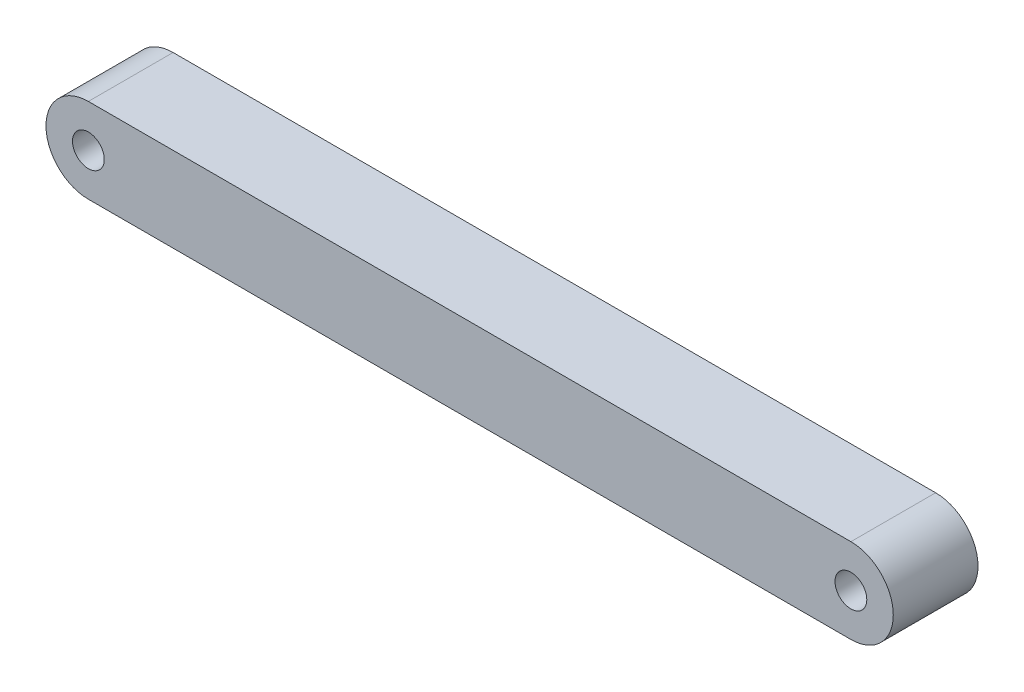
ISO-10303-21;
HEADER;
FILE_DESCRIPTION(('STEP AP214'),'2;1');
FILE_NAME('part.step','',(''),(''),'','','');
FILE_SCHEMA(('AUTOMOTIVE_DESIGN { 1 0 10303 214 1 1 1 1 }'));
ENDSEC;
DATA;
#1=APPLICATION_CONTEXT('core data for automotive mechanical design processes');
#2=APPLICATION_PROTOCOL_DEFINITION('international standard','automotive_design',2000,#1);
#3=PRODUCT_CONTEXT('',#1,'mechanical');
#4=PRODUCT('Part','Part','',(#3));
#5=PRODUCT_RELATED_PRODUCT_CATEGORY('part','',(#4));
#6=PRODUCT_DEFINITION_FORMATION('','',#4);
#7=PRODUCT_DEFINITION_CONTEXT('part definition',#1,'design');
#8=PRODUCT_DEFINITION('design','',#6,#7);
#9=PRODUCT_DEFINITION_SHAPE('','',#8);
#10=(LENGTH_UNIT() NAMED_UNIT(*) SI_UNIT(.MILLI.,.METRE.));
#11=(NAMED_UNIT(*) PLANE_ANGLE_UNIT() SI_UNIT($,.RADIAN.));
#12=(NAMED_UNIT(*) SI_UNIT($,.STERADIAN.) SOLID_ANGLE_UNIT());
#13=UNCERTAINTY_MEASURE_WITH_UNIT(LENGTH_MEASURE(1.E-05),#10,'distance_accuracy_value','');
#14=(GEOMETRIC_REPRESENTATION_CONTEXT(3) GLOBAL_UNCERTAINTY_ASSIGNED_CONTEXT((#13)) GLOBAL_UNIT_ASSIGNED_CONTEXT((#10,
#11,#12)) REPRESENTATION_CONTEXT('',''));
#15=CARTESIAN_POINT('',(0.,0.,0.));
#16=DIRECTION('',(0.,0.,1.));
#17=DIRECTION('',(1.,0.,0.));
#18=AXIS2_PLACEMENT_3D('',#15,#16,#17);
#19=CARTESIAN_POINT('',(-36.,0.,8.));
#20=DIRECTION('',(0.,0.,1.));
#21=DIRECTION('',(1.,0.,0.));
#22=AXIS2_PLACEMENT_3D('',#19,#20,#21);
#23=PLANE('',#22);
#24=CARTESIAN_POINT('',(36.,0.,8.));
#25=DIRECTION('',(0.,0.,1.));
#26=DIRECTION('',(1.,0.,0.));
#27=AXIS2_PLACEMENT_3D('',#24,#25,#26);
#28=CIRCLE('',#27,1.5);
#29=CARTESIAN_POINT('',(37.5,0.,8.));
#30=VERTEX_POINT('',#29);
#31=EDGE_CURVE('E112',#30,#30,#28,.T.);
#32=ORIENTED_EDGE('',*,*,#31,.F.);
#33=EDGE_LOOP('',(#32));
#34=FACE_BOUND('',#33,.T.);
#35=CARTESIAN_POINT('',(-36.,0.,8.));
#36=DIRECTION('',(0.,0.,1.));
#37=DIRECTION('',(1.,0.,0.));
#38=AXIS2_PLACEMENT_3D('',#35,#36,#37);
#39=CIRCLE('',#38,4.);
#40=CARTESIAN_POINT('',(-36.,4.,8.));
#41=VERTEX_POINT('',#40);
#42=CARTESIAN_POINT('',(-36.,-4.,8.));
#43=VERTEX_POINT('',#42);
#44=EDGE_CURVE('E92',#41,#43,#39,.T.);
#45=ORIENTED_EDGE('',*,*,#44,.T.);
#46=DIRECTION('',(1.,0.,0.));
#47=VECTOR('',#46,1.);
#48=CARTESIAN_POINT('',(-36.,-4.,8.));
#49=LINE('',#48,#47);
#50=CARTESIAN_POINT('',(36.,-4.,8.));
#51=VERTEX_POINT('',#50);
#52=EDGE_CURVE('E87',#43,#51,#49,.T.);
#53=ORIENTED_EDGE('',*,*,#52,.T.);
#54=CARTESIAN_POINT('',(36.,0.,8.));
#55=DIRECTION('',(0.,0.,1.));
#56=DIRECTION('',(1.,0.,0.));
#57=AXIS2_PLACEMENT_3D('',#54,#55,#56);
#58=CIRCLE('',#57,4.);
#59=CARTESIAN_POINT('',(36.,4.,8.));
#60=VERTEX_POINT('',#59);
#61=EDGE_CURVE('E90',#51,#60,#58,.T.);
#62=ORIENTED_EDGE('',*,*,#61,.T.);
#63=DIRECTION('',(-1.,0.,0.));
#64=VECTOR('',#63,1.);
#65=CARTESIAN_POINT('',(-36.,4.,8.));
#66=LINE('',#65,#64);
#67=EDGE_CURVE('E57',#60,#41,#66,.T.);
#68=ORIENTED_EDGE('',*,*,#67,.T.);
#69=EDGE_LOOP('',(#45,#53,#62,#68));
#70=FACE_BOUND('',#69,.T.);
#71=CARTESIAN_POINT('',(-36.,0.,8.));
#72=DIRECTION('',(0.,0.,1.));
#73=DIRECTION('',(1.,0.,0.));
#74=AXIS2_PLACEMENT_3D('',#71,#72,#73);
#75=CIRCLE('',#74,1.5);
#76=CARTESIAN_POINT('',(-34.5,0.,8.));
#77=VERTEX_POINT('',#76);
#78=EDGE_CURVE('E134',#77,#77,#75,.T.);
#79=ORIENTED_EDGE('',*,*,#78,.F.);
#80=EDGE_LOOP('',(#79));
#81=FACE_BOUND('',#80,.T.);
#82=ADVANCED_FACE('F39',(#34,#70,#81),#23,.T.);
#83=CARTESIAN_POINT('',(-36.,0.,0.));
#84=DIRECTION('',(0.,0.,1.));
#85=DIRECTION('',(1.,0.,0.));
#86=AXIS2_PLACEMENT_3D('',#83,#84,#85);
#87=PLANE('',#86);
#88=CARTESIAN_POINT('',(-36.,0.,0.));
#89=DIRECTION('',(0.,0.,1.));
#90=DIRECTION('',(1.,0.,0.));
#91=AXIS2_PLACEMENT_3D('',#88,#89,#90);
#92=CIRCLE('',#91,4.);
#93=CARTESIAN_POINT('',(-36.,4.,0.));
#94=VERTEX_POINT('',#93);
#95=CARTESIAN_POINT('',(-36.,-4.,0.));
#96=VERTEX_POINT('',#95);
#97=EDGE_CURVE('E108',#94,#96,#92,.T.);
#98=ORIENTED_EDGE('',*,*,#97,.F.);
#99=DIRECTION('',(-1.,0.,0.));
#100=VECTOR('',#99,1.);
#101=CARTESIAN_POINT('',(-36.,4.,0.));
#102=LINE('',#101,#100);
#103=CARTESIAN_POINT('',(36.,4.,0.));
#104=VERTEX_POINT('',#103);
#105=EDGE_CURVE('E80',#104,#94,#102,.T.);
#106=ORIENTED_EDGE('',*,*,#105,.F.);
#107=CARTESIAN_POINT('',(36.,0.,0.));
#108=DIRECTION('',(0.,0.,1.));
#109=DIRECTION('',(1.,0.,0.));
#110=AXIS2_PLACEMENT_3D('',#107,#108,#109);
#111=CIRCLE('',#110,4.);
#112=CARTESIAN_POINT('',(36.,-4.,0.));
#113=VERTEX_POINT('',#112);
#114=EDGE_CURVE('E74',#113,#104,#111,.T.);
#115=ORIENTED_EDGE('',*,*,#114,.F.);
#116=DIRECTION('',(1.,0.,0.));
#117=VECTOR('',#116,1.);
#118=CARTESIAN_POINT('',(-36.,-4.,0.));
#119=LINE('',#118,#117);
#120=EDGE_CURVE('E97',#96,#113,#119,.T.);
#121=ORIENTED_EDGE('',*,*,#120,.F.);
#122=EDGE_LOOP('',(#98,#106,#115,#121));
#123=FACE_BOUND('',#122,.T.);
#124=CARTESIAN_POINT('',(36.,0.,0.));
#125=DIRECTION('',(0.,0.,1.));
#126=DIRECTION('',(1.,0.,0.));
#127=AXIS2_PLACEMENT_3D('',#124,#125,#126);
#128=CIRCLE('',#127,1.5);
#129=CARTESIAN_POINT('',(37.5,0.,0.));
#130=VERTEX_POINT('',#129);
#131=EDGE_CURVE('E130',#130,#130,#128,.T.);
#132=ORIENTED_EDGE('',*,*,#131,.T.);
#133=EDGE_LOOP('',(#132));
#134=FACE_BOUND('',#133,.T.);
#135=CARTESIAN_POINT('',(-36.,0.,0.));
#136=DIRECTION('',(0.,0.,1.));
#137=DIRECTION('',(1.,0.,0.));
#138=AXIS2_PLACEMENT_3D('',#135,#136,#137);
#139=CIRCLE('',#138,1.5);
#140=CARTESIAN_POINT('',(-34.5,0.,0.));
#141=VERTEX_POINT('',#140);
#142=EDGE_CURVE('E138',#141,#141,#139,.T.);
#143=ORIENTED_EDGE('',*,*,#142,.T.);
#144=EDGE_LOOP('',(#143));
#145=FACE_BOUND('',#144,.T.);
#146=ADVANCED_FACE('F125',(#123,#134,#145),#87,.F.);
#147=CARTESIAN_POINT('',(-36.,0.,8.));
#148=DIRECTION('',(0.,0.,-1.));
#149=DIRECTION('',(-1.,0.,0.));
#150=AXIS2_PLACEMENT_3D('',#147,#148,#149);
#151=CYLINDRICAL_SURFACE('',#150,4.);
#152=ORIENTED_EDGE('',*,*,#97,.T.);
#153=DIRECTION('',(0.,0.,-1.));
#154=VECTOR('',#153,1.);
#155=CARTESIAN_POINT('',(-36.,-4.,8.));
#156=LINE('',#155,#154);
#157=EDGE_CURVE('E11',#43,#96,#156,.T.);
#158=ORIENTED_EDGE('',*,*,#157,.F.);
#159=ORIENTED_EDGE('',*,*,#44,.F.);
#160=DIRECTION('',(0.,0.,-1.));
#161=VECTOR('',#160,1.);
#162=CARTESIAN_POINT('',(-36.,4.,8.));
#163=LINE('',#162,#161);
#164=EDGE_CURVE('E104',#41,#94,#163,.T.);
#165=ORIENTED_EDGE('',*,*,#164,.T.);
#166=EDGE_LOOP('',(#152,#158,#159,#165));
#167=FACE_BOUND('',#166,.T.);
#168=ADVANCED_FACE('F41',(#167),#151,.T.);
#169=CARTESIAN_POINT('',(-36.,-4.,8.));
#170=DIRECTION('',(0.,1.,0.));
#171=DIRECTION('',(0.,0.,1.));
#172=AXIS2_PLACEMENT_3D('',#169,#170,#171);
#173=PLANE('',#172);
#174=ORIENTED_EDGE('',*,*,#120,.T.);
#175=DIRECTION('',(0.,0.,-1.));
#176=VECTOR('',#175,1.);
#177=CARTESIAN_POINT('',(36.,-4.,8.));
#178=LINE('',#177,#176);
#179=EDGE_CURVE('E49',#51,#113,#178,.T.);
#180=ORIENTED_EDGE('',*,*,#179,.F.);
#181=ORIENTED_EDGE('',*,*,#52,.F.);
#182=ORIENTED_EDGE('',*,*,#157,.T.);
#183=EDGE_LOOP('',(#174,#180,#181,#182));
#184=FACE_BOUND('',#183,.T.);
#185=ADVANCED_FACE('F96',(#184),#173,.F.);
#186=CARTESIAN_POINT('',(36.,0.,8.));
#187=DIRECTION('',(0.,0.,-1.));
#188=DIRECTION('',(-1.,0.,0.));
#189=AXIS2_PLACEMENT_3D('',#186,#187,#188);
#190=CYLINDRICAL_SURFACE('',#189,4.);
#191=ORIENTED_EDGE('',*,*,#114,.T.);
#192=DIRECTION('',(0.,0.,-1.));
#193=VECTOR('',#192,1.);
#194=CARTESIAN_POINT('',(36.,4.,8.));
#195=LINE('',#194,#193);
#196=EDGE_CURVE('E99',#60,#104,#195,.T.);
#197=ORIENTED_EDGE('',*,*,#196,.F.);
#198=ORIENTED_EDGE('',*,*,#61,.F.);
#199=ORIENTED_EDGE('',*,*,#179,.T.);
#200=EDGE_LOOP('',(#191,#197,#198,#199));
#201=FACE_BOUND('',#200,.T.);
#202=ADVANCED_FACE('F100',(#201),#190,.T.);
#203=CARTESIAN_POINT('',(-36.,4.,8.));
#204=DIRECTION('',(0.,-1.,0.));
#205=DIRECTION('',(0.,0.,-1.));
#206=AXIS2_PLACEMENT_3D('',#203,#204,#205);
#207=PLANE('',#206);
#208=ORIENTED_EDGE('',*,*,#105,.T.);
#209=ORIENTED_EDGE('',*,*,#164,.F.);
#210=ORIENTED_EDGE('',*,*,#67,.F.);
#211=ORIENTED_EDGE('',*,*,#196,.T.);
#212=EDGE_LOOP('',(#208,#209,#210,#211));
#213=FACE_BOUND('',#212,.T.);
#214=ADVANCED_FACE('F122',(#213),#207,.F.);
#215=CARTESIAN_POINT('',(36.,0.,8.));
#216=DIRECTION('',(0.,0.,-1.));
#217=DIRECTION('',(-1.,0.,0.));
#218=AXIS2_PLACEMENT_3D('',#215,#216,#217);
#219=CYLINDRICAL_SURFACE('',#218,1.5);
#220=ORIENTED_EDGE('',*,*,#31,.T.);
#221=EDGE_LOOP('',(#220));
#222=FACE_BOUND('',#221,.T.);
#223=ORIENTED_EDGE('',*,*,#131,.F.);
#224=EDGE_LOOP('',(#223));
#225=FACE_BOUND('',#224,.T.);
#226=ADVANCED_FACE('F157',(#222,#225),#219,.F.);
#227=CARTESIAN_POINT('',(-36.,0.,8.));
#228=DIRECTION('',(0.,0.,-1.));
#229=DIRECTION('',(-1.,0.,0.));
#230=AXIS2_PLACEMENT_3D('',#227,#228,#229);
#231=CYLINDRICAL_SURFACE('',#230,1.5);
#232=ORIENTED_EDGE('',*,*,#78,.T.);
#233=EDGE_LOOP('',(#232));
#234=FACE_BOUND('',#233,.T.);
#235=ORIENTED_EDGE('',*,*,#142,.F.);
#236=EDGE_LOOP('',(#235));
#237=FACE_BOUND('',#236,.T.);
#238=ADVANCED_FACE('F146',(#234,#237),#231,.F.);
#239=CLOSED_SHELL('',(#82,#146,#168,#185,#202,#214,#226,#238));
#240=MANIFOLD_SOLID_BREP('B2',#239);
#241=ADVANCED_BREP_SHAPE_REPRESENTATION('',(#18,#240),#14);
#242=SHAPE_DEFINITION_REPRESENTATION(#9,#241);
ENDSEC;
END-ISO-10303-21;
